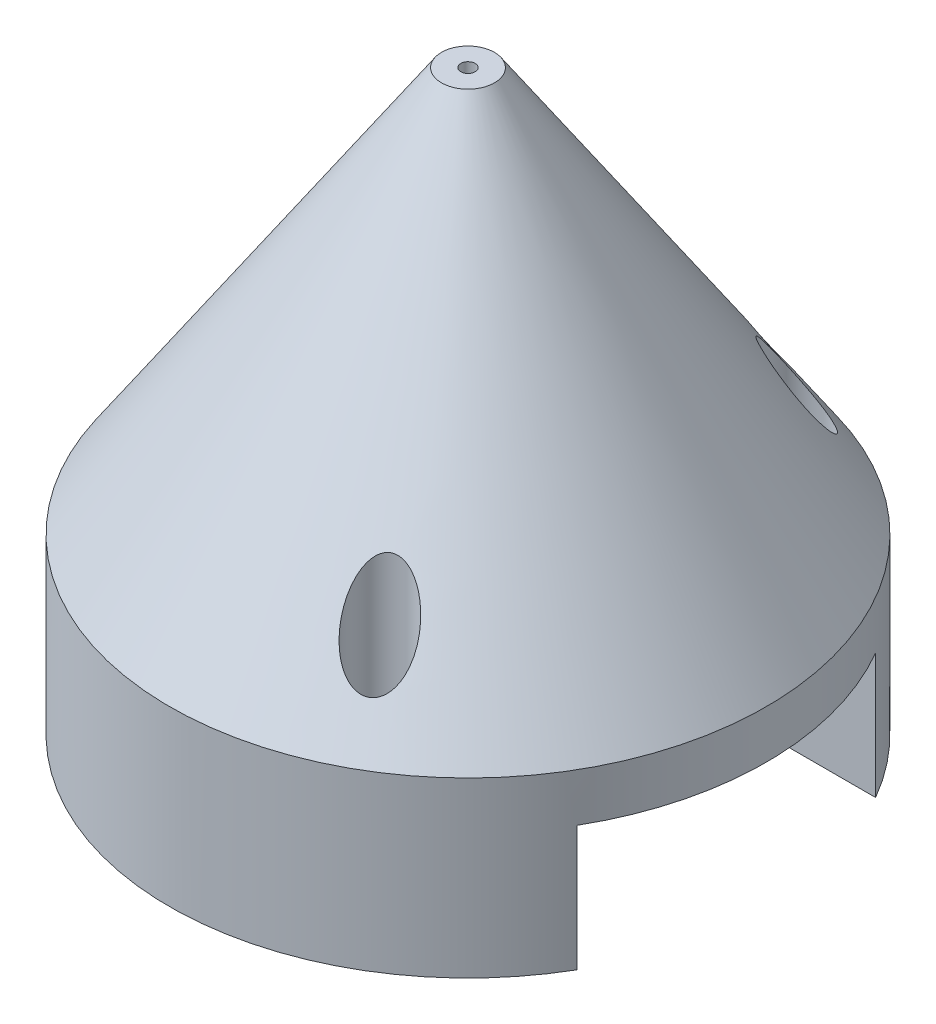
ISO-10303-21;
HEADER;
FILE_DESCRIPTION(('STEP AP214'),'2;1');
FILE_NAME('part.step','',(''),(''),'','','');
FILE_SCHEMA(('AUTOMOTIVE_DESIGN { 1 0 10303 214 1 1 1 1 }'));
ENDSEC;
DATA;
#1=APPLICATION_CONTEXT('core data for automotive mechanical design processes');
#2=APPLICATION_PROTOCOL_DEFINITION('international standard','automotive_design',2000,#1);
#3=PRODUCT_CONTEXT('',#1,'mechanical');
#4=PRODUCT('Part','Part','',(#3));
#5=PRODUCT_RELATED_PRODUCT_CATEGORY('part','',(#4));
#6=PRODUCT_DEFINITION_FORMATION('','',#4);
#7=PRODUCT_DEFINITION_CONTEXT('part definition',#1,'design');
#8=PRODUCT_DEFINITION('design','',#6,#7);
#9=PRODUCT_DEFINITION_SHAPE('','',#8);
#10=(LENGTH_UNIT() NAMED_UNIT(*) SI_UNIT(.MILLI.,.METRE.));
#11=(NAMED_UNIT(*) PLANE_ANGLE_UNIT() SI_UNIT($,.RADIAN.));
#12=(NAMED_UNIT(*) SI_UNIT($,.STERADIAN.) SOLID_ANGLE_UNIT());
#13=UNCERTAINTY_MEASURE_WITH_UNIT(LENGTH_MEASURE(1.E-05),#10,'distance_accuracy_value','');
#14=(GEOMETRIC_REPRESENTATION_CONTEXT(3) GLOBAL_UNCERTAINTY_ASSIGNED_CONTEXT((#13)) GLOBAL_UNIT_ASSIGNED_CONTEXT((#10,
#11,#12)) REPRESENTATION_CONTEXT('',''));
#15=CARTESIAN_POINT('',(0.,0.,0.));
#16=DIRECTION('',(0.,0.,1.));
#17=DIRECTION('',(1.,0.,0.));
#18=AXIS2_PLACEMENT_3D('',#15,#16,#17);
#19=CARTESIAN_POINT('',(-2.7248039285549,60.,0.));
#20=DIRECTION('',(0.,-1.,0.));
#21=DIRECTION('',(1.,0.,0.));
#22=AXIS2_PLACEMENT_3D('',#19,#20,#21);
#23=CONICAL_SURFACE('',#22,2.75,0.592112169453662);
#24=CARTESIAN_POINT('',(9.81892468476819,22.9681463679433,24.6503163790771));
#25=CARTESIAN_POINT('',(9.71175431657363,23.0383370458882,24.6518792558647));
#26=CARTESIAN_POINT('',(9.60769990579407,23.113342135412,24.647661909815));
#27=CARTESIAN_POINT('',(9.4061092604202,23.2707096242355,24.6295666741721));
#28=CARTESIAN_POINT('',(9.30858148344576,23.3530812587125,24.6156765058352));
#29=CARTESIAN_POINT('',(9.11967704423,23.5237976260614,24.5797277474133));
#30=CARTESIAN_POINT('',(9.02833335147779,23.6121700029236,24.5576289152983));
#31=CARTESIAN_POINT('',(8.85215336730015,23.7931966957878,24.5065759324488));
#32=CARTESIAN_POINT('',(8.76731517630449,23.8858497490956,24.4776237930109));
#33=CARTESIAN_POINT('',(8.57045398776997,24.1130237982506,24.400884911565));
#34=CARTESIAN_POINT('',(8.46146174607309,24.2492037958046,24.3502331010308));
#35=CARTESIAN_POINT('',(8.25492344513037,24.5263558072632,24.2395533825569));
#36=CARTESIAN_POINT('',(8.15738332784702,24.6673302602906,24.1795206446225));
#37=CARTESIAN_POINT('',(7.9731139000441,24.9526936468035,24.0516905962282));
#38=CARTESIAN_POINT('',(7.88638217527903,25.097081809173,23.9838950262495));
#39=CARTESIAN_POINT('',(7.72316223872366,25.3883204661096,23.8417225389886));
#40=CARTESIAN_POINT('',(7.64667316394029,25.5351707520562,23.7673461770482));
#41=CARTESIAN_POINT('',(7.47159372016466,25.8964570102,23.5784856884039));
#42=CARTESIAN_POINT('',(7.37833252984988,26.1118645479697,23.4608919231908));
#43=CARTESIAN_POINT('',(7.21149314141496,26.5446885398245,23.2156975515183));
#44=CARTESIAN_POINT('',(7.13792539650536,26.7621059976796,23.0880916769492));
#45=CARTESIAN_POINT('',(7.01033976187804,27.1975168051742,22.8241216463618));
#46=CARTESIAN_POINT('',(6.95633220507141,27.415510398097,22.6877529059048));
#47=CARTESIAN_POINT('',(6.86844118665959,27.8504115828426,22.4071978322987));
#48=CARTESIAN_POINT('',(6.83454714463722,28.067319686019,22.2630156529346));
#49=CARTESIAN_POINT('',(6.79634588515203,28.4226248819878,22.0192297377959));
#50=CARTESIAN_POINT('',(6.78582804497034,28.5618378341702,21.9217563387085));
#51=CARTESIAN_POINT('',(6.77444793715917,28.8384673708788,21.7237643114574));
#52=CARTESIAN_POINT('',(6.77358365265287,28.9758843246427,21.6232463237875));
#53=CARTESIAN_POINT('',(6.78238528068164,29.2478494670785,21.4193920473677));
#54=CARTESIAN_POINT('',(6.79202873835247,29.3824031491635,21.3160622267277));
#55=CARTESIAN_POINT('',(6.82306177293796,29.6477256804183,21.1064619509774));
#56=CARTESIAN_POINT('',(6.84444534672708,29.778496427988,21.000193025083));
#57=CARTESIAN_POINT('',(6.90402607625135,30.0497315433759,20.7720602252421));
#58=CARTESIAN_POINT('',(6.94389524533639,30.1895442845209,20.6498245347974));
#59=CARTESIAN_POINT('',(7.01901515937321,30.3913295125002,20.4640835311892));
#60=CARTESIAN_POINT('',(7.04660960054174,30.4572720640598,20.401768751846));
#61=CARTESIAN_POINT('',(7.10751529002262,30.5857767224469,20.2764688905868));
#62=CARTESIAN_POINT('',(7.14082485606949,30.6483398169234,20.21348401102));
#63=CARTESIAN_POINT('',(7.22992717791572,30.7957902233958,20.0591931572683));
#64=CARTESIAN_POINT('',(7.28916368522575,30.8783874009305,19.9676202503764));
#65=CARTESIAN_POINT('',(7.42319720641371,31.0304897024569,19.7849242776056));
#66=CARTESIAN_POINT('',(7.49796344258256,31.1000202112474,19.6938006815292));
#67=CARTESIAN_POINT('',(7.64141522471294,31.2031465607041,19.5400188989636));
#68=CARTESIAN_POINT('',(7.70589223608405,31.2413486475021,19.4765657514862));
#69=CARTESIAN_POINT('',(7.84384204246307,31.3051701206168,19.3531569750827));
#70=CARTESIAN_POINT('',(7.91730474561358,31.3308034637153,19.2931975321403));
#71=CARTESIAN_POINT('',(8.07279117597584,31.3671665926049,19.1785497894393));
#72=CARTESIAN_POINT('',(8.15488274098596,31.3777670552816,19.1239109509235));
#73=CARTESIAN_POINT('',(8.32443551106708,31.3823390343652,19.022894652775));
#74=CARTESIAN_POINT('',(8.41189525008586,31.3763150713318,18.9765149509462));
#75=CARTESIAN_POINT('',(8.57824747297976,31.3500876579438,18.8984075638014));
#76=CARTESIAN_POINT('',(8.65692512758836,31.3316515251106,18.8655943145927));
#77=CARTESIAN_POINT('',(8.81381245635934,31.2840560803526,18.8076178680729));
#78=CARTESIAN_POINT('',(8.89202188509359,31.2548915729932,18.782458388059));
#79=CARTESIAN_POINT('',(9.08500815538848,31.1710262604499,18.7286368860428));
#80=CARTESIAN_POINT('',(9.1986338294643,31.1108383768505,18.7044522382036));
#81=CARTESIAN_POINT('',(9.41955123897961,30.9764852866306,18.6696778015186));
#82=CARTESIAN_POINT('',(9.52682464699593,30.9022819999043,18.6591256796579));
#83=CARTESIAN_POINT('',(9.7167775489822,30.7576868469777,18.6499664416458));
#84=CARTESIAN_POINT('',(9.80054065489763,30.6887863724122,18.6496356395047));
#85=CARTESIAN_POINT('',(9.9634956089938,30.5459738451371,18.6554394061393));
#86=CARTESIAN_POINT('',(10.0426842928696,30.4720583984483,18.6615783951418));
#87=CARTESIAN_POINT('',(10.1968034462851,30.3203673306701,18.679394211858));
#88=CARTESIAN_POINT('',(10.2717274842081,30.2425861940997,18.6910791680628));
#89=CARTESIAN_POINT('',(10.4174994816405,30.0841116934288,18.719261107801));
#90=CARTESIAN_POINT('',(10.488345957693,30.0034172866097,18.735759829545));
#91=CARTESIAN_POINT('',(10.6820128497927,29.7735716322239,18.7880474972362));
#92=CARTESIAN_POINT('',(10.8005099292611,29.6218543155026,18.828643829555));
#93=CARTESIAN_POINT('',(11.0263309222846,29.3136263148129,18.9212498409892));
#94=CARTESIAN_POINT('',(11.133646213148,29.1571120503484,18.9732682334277));
#95=CARTESIAN_POINT('',(11.3381540789879,28.8406188312475,19.0872601699283));
#96=CARTESIAN_POINT('',(11.4353237646238,28.6806329856472,19.1492554553059));
#97=CARTESIAN_POINT('',(11.6197958462313,28.358715848473,19.2820162350544));
#98=CARTESIAN_POINT('',(11.7071001783492,28.196784945556,19.3527800028124));
#99=CARTESIAN_POINT('',(11.9007299643649,27.8155219662376,19.5282309653154));
#100=CARTESIAN_POINT('',(12.0031847145082,27.5957151820307,19.6361840064544));
#101=CARTESIAN_POINT('',(12.1908172415893,27.1555950108947,19.8654956916684));
#102=CARTESIAN_POINT('',(12.2759864706413,26.9352814275435,19.9868609226282));
#103=CARTESIAN_POINT('',(12.4280912726729,26.4960940936322,20.2420283024133));
#104=CARTESIAN_POINT('',(12.4950575288676,26.2772185346781,20.3758090063247));
#105=CARTESIAN_POINT('',(12.6093662389569,25.8422092421615,20.6554980322571));
#106=CARTESIAN_POINT('',(12.6567219724013,25.6260737495797,20.8013980668563));
#107=CARTESIAN_POINT('',(12.713963495255,25.2888170958293,21.0409146184167));
#108=CARTESIAN_POINT('',(12.7312275593523,25.1661160370759,21.1305913426609));
#109=CARTESIAN_POINT('',(12.7576695387633,24.9227904930492,21.3138481194231));
#110=CARTESIAN_POINT('',(12.7668494130894,24.8021655116382,21.4074272205324));
#111=CARTESIAN_POINT('',(12.7762617839242,24.5637074037459,21.5983461996986));
#112=CARTESIAN_POINT('',(12.7765018327099,24.44587200477,21.6956828338282));
#113=CARTESIAN_POINT('',(12.7669537809626,24.2137849940005,21.8940145396849));
#114=CARTESIAN_POINT('',(12.7571688840741,24.0995322493293,21.9950084327255));
#115=CARTESIAN_POINT('',(12.7201210003866,23.8315936528534,22.2409203413609));
#116=CARTESIAN_POINT('',(12.6874952485234,23.6800833274089,22.3874834604993));
#117=CARTESIAN_POINT('',(12.5952546177022,23.39088132022,22.6858124193257));
#118=CARTESIAN_POINT('',(12.5356860611421,23.2531664145297,22.8375689178858));
#119=CARTESIAN_POINT('',(12.4083971233779,23.0410397234363,23.09262826397));
#120=CARTESIAN_POINT('',(12.3497712561824,22.9606873642528,23.1954842494528));
#121=CARTESIAN_POINT('',(12.2155444120707,22.8133842699786,23.3998020548958));
#122=CARTESIAN_POINT('',(12.1399686854584,22.7464138774648,23.5012657128443));
#123=CARTESIAN_POINT('',(11.9880272003176,22.6424179073172,23.6789559570859));
#124=CARTESIAN_POINT('',(11.9150180341887,22.6020666451275,23.7560825510542));
#125=CARTESIAN_POINT('',(11.7577524422141,22.5353374232943,23.9047744224037));
#126=CARTESIAN_POINT('',(11.6735054807876,22.5089477971031,23.9763443002472));
#127=CARTESIAN_POINT('',(11.4946597775895,22.4721984270001,24.1115445272975));
#128=CARTESIAN_POINT('',(11.3999965667333,22.4619453057621,24.1751195338047));
#129=CARTESIAN_POINT('',(11.2037943085062,22.458831766571,24.2911052713799));
#130=CARTESIAN_POINT('',(11.1022564574067,22.4659683301242,24.3435179382847));
#131=CARTESIAN_POINT('',(10.9065927498695,22.4953149270133,24.4309700211916));
#132=CARTESIAN_POINT('',(10.8127600323137,22.5159222467634,24.4672325413613));
#133=CARTESIAN_POINT('',(10.6251012492638,22.5690815402157,24.5294270336775));
#134=CARTESIAN_POINT('',(10.5312751939954,22.6016370545078,24.5553559389244));
#135=CARTESIAN_POINT('',(10.3314822092628,22.6825237844355,24.6006480496581));
#136=CARTESIAN_POINT('',(10.2258294905642,22.7324978089078,24.6184213946972));
#137=CARTESIAN_POINT('',(10.0188769094323,22.8429978877632,24.6425407122131));
#138=CARTESIAN_POINT('',(9.91758054209569,22.9035322248204,24.6488776702999));
#139=CARTESIAN_POINT('',(9.81892468476819,22.9681463679433,24.6503163790771));
#140=B_SPLINE_CURVE_WITH_KNOTS('',3,(#24,#25,#26,#27,#28,#29,#30,#31,#32,#33,#34,#35,#36,#37,
#38,#39,#40,#41,#42,#43,#44,#45,#46,#47,#48,#49,#50,#51,#52,#53,#54,#55,#56,#57,#58,#59,#60,#61,
#62,#63,#64,#65,#66,#67,#68,#69,#70,#71,#72,#73,#74,#75,#76,#77,#78,#79,#80,#81,#82,#83,#84,#85,
#86,#87,#88,#89,#90,#91,#92,#93,#94,#95,#96,#97,#98,#99,#100,#101,#102,#103,#104,#105,#106,#107,
#108,#109,#110,#111,#112,#113,#114,#115,#116,#117,#118,#119,#120,#121,#122,#123,#124,#125,#126,
#127,#128,#129,#130,#131,#132,#133,#134,#135,#136,#137,#138,#139),.UNSPECIFIED.,.T.,.F.,(4,2,2,
2,2,2,2,2,2,2,2,2,2,2,2,2,2,2,2,2,2,2,2,2,2,2,2,2,2,2,2,2,2,2,2,2,2,2,2,2,2,2,2,2,2,2,2,2,2,2,2,
2,2,2,2,2,2,4),(0.,0.384126322893622,0.768741149213652,1.15526694000265,1.541679434212,
2.0857450302144,2.6300916800202,3.17431652160853,3.7184954807179,4.50504115318169,
5.29200349714424,6.0793809594046,6.86634386538806,7.37688864104268,7.88732674872684,
8.39667619442848,8.90576543446484,9.47431228415176,9.75861436190314,10.0428328975396,
10.4521125823219,10.8605887428986,11.1541287376024,11.447342032632,11.7430627569243,
12.0387030759492,12.2992634538066,12.5599501798243,12.9502408628465,13.3416076378417,
13.6665360969028,13.9916866943846,14.317315330044,14.6430616933288,15.2323502853013,
15.8220899878135,16.4131326811488,17.0040591759214,17.7994503273771,18.595233855503,
19.3896675610842,20.1835624211884,20.6421987782369,21.1007239649932,21.5588617853752,
22.0168532455585,22.6550761561125,23.2922059253588,23.7201940593106,24.1475488025858,
24.4870464771266,24.8262600125683,25.1677056450014,25.5090920136772,25.8158434989183,
26.1226859568393,26.4760156900556,26.829623803432),.UNSPECIFIED.);
#141=CARTESIAN_POINT('',(9.81892468476819,22.9681463679433,24.6503163790771));
#142=VERTEX_POINT('',#141);
#143=EDGE_CURVE('E113',#142,#142,#140,.T.);
#144=ORIENTED_EDGE('',*,*,#143,.T.);
#145=EDGE_LOOP('',(#144));
#146=FACE_BOUND('',#145,.T.);
#147=CARTESIAN_POINT('',(-2.7248039285549,60.,0.));
#148=DIRECTION('',(0.,1.,0.));
#149=DIRECTION('',(-1.,0.,0.));
#150=AXIS2_PLACEMENT_3D('',#147,#148,#149);
#151=CIRCLE('',#150,2.75);
#152=CARTESIAN_POINT('',(-5.4748039285549,60.,0.));
#153=VERTEX_POINT('',#152);
#154=EDGE_CURVE('E80',#153,#153,#151,.T.);
#155=ORIENTED_EDGE('',*,*,#154,.F.);
#156=EDGE_LOOP('',(#155));
#157=FACE_BOUND('',#156,.T.);
#158=CARTESIAN_POINT('',(-2.7248039285549,18.,0.));
#159=DIRECTION('',(0.,1.,0.));
#160=DIRECTION('',(-1.,0.,0.));
#161=AXIS2_PLACEMENT_3D('',#158,#159,#160);
#162=CIRCLE('',#161,31.);
#163=CARTESIAN_POINT('',(-33.7248039285549,18.,0.));
#164=VERTEX_POINT('',#163);
#165=EDGE_CURVE('E153',#164,#164,#162,.T.);
#166=ORIENTED_EDGE('',*,*,#165,.T.);
#167=EDGE_LOOP('',(#166));
#168=FACE_BOUND('',#167,.T.);
#169=CARTESIAN_POINT('',(-30.5054118122256,22.7524313597325,-1.12615265273772));
#170=CARTESIAN_POINT('',(-30.4409707701596,22.8385786249351,-1.28525887783984));
#171=CARTESIAN_POINT('',(-30.3655733265612,22.939647901942,-1.43212663372406));
#172=CARTESIAN_POINT('',(-30.2421924948899,23.1057799359499,-1.63372326899994));
#173=CARTESIAN_POINT('',(-30.19918950725,23.1637982186939,-1.69798864411151));
#174=CARTESIAN_POINT('',(-30.1104033589527,23.2838588201346,-1.82061132164044));
#175=CARTESIAN_POINT('',(-30.0646207161147,23.3459003894828,-1.87896971909325));
#176=CARTESIAN_POINT('',(-29.9501356119617,23.5014187091377,-2.014674656505));
#177=CARTESIAN_POINT('',(-29.8802559197009,23.5966570517023,-2.08899602596415));
#178=CARTESIAN_POINT('',(-29.7372745420672,23.7922544126897,-2.22706944609588));
#179=CARTESIAN_POINT('',(-29.6641711295398,23.8926161807136,-2.29081574175347));
#180=CARTESIAN_POINT('',(-29.5157307398823,24.097203655073,-2.40864237406987));
#181=CARTESIAN_POINT('',(-29.4403942811965,24.2014284659149,-2.46272493417135));
#182=CARTESIAN_POINT('',(-29.2881482993478,24.4129075086674,-2.56207228337111));
#183=CARTESIAN_POINT('',(-29.2112382440025,24.5201627702937,-2.60733403297088));
#184=CARTESIAN_POINT('',(-29.0096129231187,24.8025157927312,-2.71460492981343));
#185=CARTESIAN_POINT('',(-28.8840751020111,24.9794705095757,-2.77022253208341));
#186=CARTESIAN_POINT('',(-28.6318695363632,25.3374594765901,-2.86273870517096));
#187=CARTESIAN_POINT('',(-28.5052011617664,25.5184961001006,-2.89962607640048));
#188=CARTESIAN_POINT('',(-28.2515435464025,25.8836350682021,-2.95625928184561));
#189=CARTESIAN_POINT('',(-28.1245542670797,26.0677437423394,-2.97596364883916));
#190=CARTESIAN_POINT('',(-27.8714089244505,26.4374591435085,-2.99910922520618));
#191=CARTESIAN_POINT('',(-27.7452526856132,26.6230655353681,-3.00255397743775));
#192=CARTESIAN_POINT('',(-27.4884124033988,27.0037759676538,-2.99356183666021));
#193=CARTESIAN_POINT('',(-27.3577999121949,27.1989102054641,-2.98035850220354));
#194=CARTESIAN_POINT('',(-27.0988474484454,27.5888693942604,-2.93690686749563));
#195=CARTESIAN_POINT('',(-26.9705081170059,27.7836942443172,-2.90665383520112));
#196=CARTESIAN_POINT('',(-26.7173118922842,28.1711509045477,-2.82885867661913));
#197=CARTESIAN_POINT('',(-26.5924440954425,28.3637880939992,-2.78137938897174));
#198=CARTESIAN_POINT('',(-26.3466433180439,28.7460374773344,-2.66814234310258));
#199=CARTESIAN_POINT('',(-26.225707864246,28.9356515328037,-2.60239633220702));
#200=CARTESIAN_POINT('',(-25.9947142012167,29.3007098528076,-2.45452030187566));
#201=CARTESIAN_POINT('',(-25.8844142523616,29.4763894321818,-2.37336969764094));
#202=CARTESIAN_POINT('',(-25.7234110750824,29.734716221016,-2.23593480672722));
#203=CARTESIAN_POINT('',(-25.6704046997687,29.8200897637647,-2.18741635457007));
#204=CARTESIAN_POINT('',(-25.5662313005299,29.9884866698441,-2.08468712396905));
#205=CARTESIAN_POINT('',(-25.515063738905,30.0715107186715,-2.0304780280471));
#206=CARTESIAN_POINT('',(-25.4142325016401,30.2356993057478,-1.91499837751489));
#207=CARTESIAN_POINT('',(-25.3646002788635,30.3168210113258,-1.85363889208912));
#208=CARTESIAN_POINT('',(-25.2681392040452,30.4750258493488,-1.72375947442535));
#209=CARTESIAN_POINT('',(-25.2213117226947,30.5521070048971,-1.6552360853441));
#210=CARTESIAN_POINT('',(-25.131499157932,30.7004225265904,-1.51062252606935));
#211=CARTESIAN_POINT('',(-25.088495781462,30.7716845783533,-1.43457251959916));
#212=CARTESIAN_POINT('',(-25.0072241251893,30.9067548799366,-1.27391116013828));
#213=CARTESIAN_POINT('',(-24.9689487848068,30.9705742360874,-1.1893129246681));
#214=CARTESIAN_POINT('',(-24.9020133812292,31.0824574991427,-1.01948746170751));
#215=CARTESIAN_POINT('',(-24.872782194133,31.1314470099508,-0.935106298214802));
#216=CARTESIAN_POINT('',(-24.8209319253788,31.2184987916331,-0.758908842910004));
#217=CARTESIAN_POINT('',(-24.7983093759664,31.256566793169,-0.667096482891662));
#218=CARTESIAN_POINT('',(-24.7612045041018,31.3190759945615,-0.476054234690661));
#219=CARTESIAN_POINT('',(-24.7468158785065,31.3433603205312,-0.3767529803692));
#220=CARTESIAN_POINT('',(-24.7281749350493,31.3748321595737,-0.174564814472995));
#221=CARTESIAN_POINT('',(-24.7239094176874,31.382041936091,-0.071682749817347));
#222=CARTESIAN_POINT('',(-24.7258920358999,31.3786929059792,0.121343426715041));
#223=CARTESIAN_POINT('',(-24.7309467147336,31.3701510870693,0.211543049071452));
#224=CARTESIAN_POINT('',(-24.7487855768649,31.3400365858427,0.388944880043752));
#225=CARTESIAN_POINT('',(-24.76157513266,31.3184548462563,0.476144960702134));
#226=CARTESIAN_POINT('',(-24.7981327841184,31.2568607164943,0.668236789334551));
#227=CARTESIAN_POINT('',(-24.8239188142377,31.2134685149866,0.771646783227253));
#228=CARTESIAN_POINT('',(-24.8837297520391,31.1130867653598,0.969015074393575));
#229=CARTESIAN_POINT('',(-24.9177711646751,31.0560699810536,1.06295389654647));
#230=CARTESIAN_POINT('',(-25.0129122487774,30.8972122020122,1.29171826098144));
#231=CARTESIAN_POINT('',(-25.0784381821267,30.7882377484215,1.41968703729292));
#232=CARTESIAN_POINT('',(-25.2190683033588,30.55568270568,1.65534981902866));
#233=CARTESIAN_POINT('',(-25.2941963522978,30.4320657883465,1.76299160268873));
#234=CARTESIAN_POINT('',(-25.4432072304251,30.1883395447917,1.95121034544437));
#235=CARTESIAN_POINT('',(-25.51648007981,30.069089808682,2.03341042098922));
#236=CARTESIAN_POINT('',(-25.6670424980114,29.825398542955,2.18565540223149));
#237=CARTESIAN_POINT('',(-25.744335141636,29.7009530538052,2.25569081986));
#238=CARTESIAN_POINT('',(-25.9021538403144,29.4482747265619,2.3850296876394));
#239=CARTESIAN_POINT('',(-25.9826852717369,29.3200356930813,2.44431431045339));
#240=CARTESIAN_POINT('',(-26.1462781545125,29.0609956248974,2.55301703370937));
#241=CARTESIAN_POINT('',(-26.229340370323,28.9301938204199,2.60243211817829));
#242=CARTESIAN_POINT('',(-26.4471147988759,28.5891933960988,2.71854553673487));
#243=CARTESIAN_POINT('',(-26.5834245634122,28.3776213139853,2.77827324894182));
#244=CARTESIAN_POINT('',(-26.8600648563853,27.9520826065623,2.87641408177333));
#245=CARTESIAN_POINT('',(-27.0003977999417,27.7381145920069,2.91481410516112));
#246=CARTESIAN_POINT('',(-27.2841137193346,27.3093457839299,2.97097815460498));
#247=CARTESIAN_POINT('',(-27.4274981812939,27.0945446283216,2.98873188013306));
#248=CARTESIAN_POINT('',(-27.7162713571876,26.6656833406288,3.00346829387583));
#249=CARTESIAN_POINT('',(-27.8616591608784,26.4516229239204,3.00046012388727));
#250=CARTESIAN_POINT('',(-28.1201678201229,26.0742130290595,2.97598253236831));
#251=CARTESIAN_POINT('',(-28.2330847498678,25.9104332400117,2.95888037180653));
#252=CARTESIAN_POINT('',(-28.4589870258216,25.5848513385754,2.91106710775026));
#253=CARTESIAN_POINT('',(-28.5719723791909,25.4230494952032,2.88035417378653));
#254=CARTESIAN_POINT('',(-28.796976637966,25.1028122324617,2.80437357656668));
#255=CARTESIAN_POINT('',(-28.9089972901736,24.9443691686912,2.75914387864072));
#256=CARTESIAN_POINT('',(-29.1312977650645,24.6318008244255,2.65272639343545));
#257=CARTESIAN_POINT('',(-29.2415786068008,24.4776729720474,2.59154834574095));
#258=CARTESIAN_POINT('',(-29.4713690580024,24.1583266172116,2.44341243735594));
#259=CARTESIAN_POINT('',(-29.5905253399115,23.9938047726665,2.35433186391325));
#260=CARTESIAN_POINT('',(-29.7640860449834,23.755544163379,2.20164555153595));
#261=CARTESIAN_POINT('',(-29.8210804734239,23.6775400553329,2.14756886001657));
#262=CARTESIAN_POINT('',(-29.9327932664084,23.5250693472746,2.03253822120153));
#263=CARTESIAN_POINT('',(-29.987512185037,23.4506018854573,1.97158596168031));
#264=CARTESIAN_POINT('',(-30.1212790698764,23.2690314277825,1.80913725839643));
#265=CARTESIAN_POINT('',(-30.1984486578358,23.1647273234502,1.70285398865105));
#266=CARTESIAN_POINT('',(-30.3425524689249,22.9706070100028,1.47168768123434));
#267=CARTESIAN_POINT('',(-30.4095059450642,22.8807635308011,1.34684052814501));
#268=CARTESIAN_POINT('',(-30.5115415987456,22.7441979162082,1.11589553092989));
#269=CARTESIAN_POINT('',(-30.5502895105377,22.6924571525773,1.01441727851032));
#270=CARTESIAN_POINT('',(-30.6176470340285,22.6026401738202,0.802370290852159));
#271=CARTESIAN_POINT('',(-30.6462646594814,22.564553157335,0.691808826756777));
#272=CARTESIAN_POINT('',(-30.6912325181051,22.5047535519858,0.462643453207352));
#273=CARTESIAN_POINT('',(-30.70746238478,22.4832016171839,0.34397254311446));
#274=CARTESIAN_POINT('',(-30.7254264961199,22.4593486554741,0.103630252090297));
#275=CARTESIAN_POINT('',(-30.7271717352918,22.4570330273125,-0.0180387827504194));
#276=CARTESIAN_POINT('',(-30.7167983758188,22.4708049741648,-0.242519811561146));
#277=CARTESIAN_POINT('',(-30.706581465299,22.4843681806714,-0.345592794923484));
#278=CARTESIAN_POINT('',(-30.676180566341,22.5247665339622,-0.547537398944022));
#279=CARTESIAN_POINT('',(-30.6559974626772,22.5516005026007,-0.64640939170984));
#280=CARTESIAN_POINT('',(-30.6143716326017,22.6070213695424,-0.809470177250507));
#281=CARTESIAN_POINT('',(-30.5950847250557,22.632718807945,-0.875235976213939));
#282=CARTESIAN_POINT('',(-30.5528627113728,22.6890369922856,-1.00330761974973));
#283=CARTESIAN_POINT('',(-30.5299303118868,22.7196540857319,-1.0656159854029));
#284=CARTESIAN_POINT('',(-30.5054118122256,22.7524313597325,-1.12615265273772));
#285=B_SPLINE_CURVE_WITH_KNOTS('',3,(#169,#170,#171,#172,#173,#174,#175,#176,#177,#178,#179,
#180,#181,#182,#183,#184,#185,#186,#187,#188,#189,#190,#191,#192,#193,#194,#195,#196,#197,#198,
#199,#200,#201,#202,#203,#204,#205,#206,#207,#208,#209,#210,#211,#212,#213,#214,#215,#216,#217,
#218,#219,#220,#221,#222,#223,#224,#225,#226,#227,#228,#229,#230,#231,#232,#233,#234,#235,#236,
#237,#238,#239,#240,#241,#242,#243,#244,#245,#246,#247,#248,#249,#250,#251,#252,#253,#254,#255,
#256,#257,#258,#259,#260,#261,#262,#263,#264,#265,#266,#267,#268,#269,#270,#271,#272,#273,#274,
#275,#276,#277,#278,#279,#280,#281,#282,#283,#284),.UNSPECIFIED.,.T.,.F.,(4,2,2,2,2,2,2,2,2,2,2,
2,2,2,2,2,2,2,2,2,2,2,2,2,2,2,2,2,2,2,2,2,2,2,2,2,2,2,2,2,2,2,2,2,2,2,2,2,2,2,2,2,2,2,2,2,2,4),
(0.,0.575795784903157,0.86564726848714,1.1554449206158,1.5734823337387,1.99174650414391,
2.40991431561463,2.82822596667683,3.4991400840532,4.17045489800402,4.84338532755259,
5.51616912342388,6.22108824958466,6.92620311831798,7.62877128391345,8.33088866972116,
8.99802717454469,9.33264968622316,9.66717353904763,10.0064227392962,10.3458364018243,
10.683527644915,11.0207083409719,11.32539952794,11.6299305457502,11.9378613409395,
12.2453904046653,12.5162349145545,12.7872677642651,13.1305632222544,13.4745507713887,
14.0127338113524,14.5522812189839,15.038535247,15.5251668519341,16.0126426097719,
16.5002671052509,17.27518968646,18.050587619426,18.8263722360646,19.6018152840496,
20.200390110943,20.7990454626853,21.3961477519036,21.9928862442369,22.6565975346074,
22.9884915692032,23.3203043089501,23.8219068892846,24.3225521663286,24.682223523734,
25.0416097171206,25.4044449560694,25.7670047609622,26.0789428726312,26.3908532961733,
26.6100938506878,26.8291723805259),.UNSPECIFIED.);
#286=CARTESIAN_POINT('',(-30.5054118122256,22.7524313597325,-1.12615265273772));
#287=VERTEX_POINT('',#286);
#288=EDGE_CURVE('E104',#287,#287,#285,.T.);
#289=ORIENTED_EDGE('',*,*,#288,.T.);
#290=EDGE_LOOP('',(#289));
#291=FACE_BOUND('',#290,.T.);
#292=CARTESIAN_POINT('',(9.81892468476782,22.9681463679434,-24.6503163790773));
#293=CARTESIAN_POINT('',(9.9216937806006,22.9008389385149,-24.6488171339514));
#294=CARTESIAN_POINT('',(10.0273347210191,22.8379543785461,-24.6420025891629));
#295=CARTESIAN_POINT('',(10.2433456348668,22.7237391651368,-24.6158761063843));
#296=CARTESIAN_POINT('',(10.3537146530548,22.6724061908445,-24.5965666817919));
#297=CARTESIAN_POINT('',(10.5782691437449,22.5840463985687,-24.5434709665511));
#298=CARTESIAN_POINT('',(10.6924825407244,22.5471756590808,-24.5095346107326));
#299=CARTESIAN_POINT('',(10.9197898879744,22.4918801381132,-24.4263296083496));
#300=CARTESIAN_POINT('',(11.0328851783116,22.4734296802229,-24.3770824298709));
#301=CARTESIAN_POINT('',(11.241272597224,22.4578352478987,-24.2703336243893));
#302=CARTESIAN_POINT('',(11.3371657130647,22.4585986021322,-24.214305299356));
#303=CARTESIAN_POINT('',(11.5211157849629,22.4762517967529,-24.0927483465927));
#304=CARTESIAN_POINT('',(11.6091715966218,22.4931439880543,-24.0272183350928));
#305=CARTESIAN_POINT('',(11.7694577628487,22.5398797682324,-23.8940790325259));
#306=CARTESIAN_POINT('',(11.842360693662,22.5687498960833,-23.8269247569018));
#307=CARTESIAN_POINT('',(11.9787150218488,22.6373213953115,-23.688756640353));
#308=CARTESIAN_POINT('',(12.0421635788162,22.6770260116241,-23.6177416482523));
#309=CARTESIAN_POINT('',(12.1912335969862,22.7891089534092,-23.4347899724352));
#310=CARTESIAN_POINT('',(12.2704478226419,22.8675796840298,-23.3213703130093));
#311=CARTESIAN_POINT('',(12.4087491222953,23.0396252476713,-23.0936374650581));
#312=CARTESIAN_POINT('',(12.4677807582737,23.1332406590444,-22.9793226838336));
#313=CARTESIAN_POINT('',(12.5571405881316,23.30907281731,-22.7776145724962));
#314=CARTESIAN_POINT('',(12.5909318350072,23.3892038522707,-22.6898805244831));
#315=CARTESIAN_POINT('',(12.6491438270975,23.5544877053722,-22.5159897429523));
#316=CARTESIAN_POINT('',(12.6735593057371,23.6396433150367,-22.4298339217575));
#317=CARTESIAN_POINT('',(12.7140756209061,23.8139201575049,-22.2594552480599));
#318=CARTESIAN_POINT('',(12.7301674579852,23.90304556986,-22.1752345814164));
#319=CARTESIAN_POINT('',(12.7548959086556,24.0843811505797,-22.0090290757705));
#320=CARTESIAN_POINT('',(12.76353000577,24.1765923492922,-21.9270450004943));
#321=CARTESIAN_POINT('',(12.7774538964916,24.4229174438242,-21.714050676429));
#322=CARTESIAN_POINT('',(12.7771207949467,24.5790890121848,-21.5850353610181));
#323=CARTESIAN_POINT('',(12.7610653640162,24.8959989957974,-21.3337131723678));
#324=CARTESIAN_POINT('',(12.7453335645554,25.0567401622484,-21.211410476217));
#325=CARTESIAN_POINT('',(12.700276579406,25.381760654583,-20.9734347120489));
#326=CARTESIAN_POINT('',(12.6709190839601,25.5460475003428,-20.8577781401844));
#327=CARTESIAN_POINT('',(12.5999740457308,25.8767245238187,-20.6335560110151));
#328=CARTESIAN_POINT('',(12.5583882402466,26.0431143995417,-20.524989449095));
#329=CARTESIAN_POINT('',(12.4493881655246,26.4288031320163,-20.2826435690715));
#330=CARTESIAN_POINT('',(12.3779636164306,26.6485846900292,-20.1514220150743));
#331=CARTESIAN_POINT('',(12.2172016606971,27.088964453695,-19.9017311769373));
#332=CARTESIAN_POINT('',(12.1278552467729,27.3095630150218,-19.7832683513582));
#333=CARTESIAN_POINT('',(11.9320877267627,27.7494722335053,-19.5602308236098));
#334=CARTESIAN_POINT('',(11.8257062300055,27.9687846837513,-19.4556249085343));
#335=CARTESIAN_POINT('',(11.5956310879745,28.404813823019,-19.2613477944714));
#336=CARTESIAN_POINT('',(11.4719506815008,28.6215323607492,-19.1716652885061));
#337=CARTESIAN_POINT('',(11.2741649888088,28.9405477670673,-19.0508532319874));
#338=CARTESIAN_POINT('',(11.2070103928102,29.0447410341665,-19.0132159481153));
#339=CARTESIAN_POINT('',(11.0681020138961,29.2515613790878,-18.9424112038113));
#340=CARTESIAN_POINT('',(10.996349110458,29.3541887517831,-18.9092428923816));
#341=CARTESIAN_POINT('',(10.8479540195193,29.557417513751,-18.847843643334));
#342=CARTESIAN_POINT('',(10.7713106383825,29.6580184004681,-18.8196139174334));
#343=CARTESIAN_POINT('',(10.6128113116981,29.8564950276373,-18.7687380161969));
#344=CARTESIAN_POINT('',(10.5309563418487,29.9543712732861,-18.7460907995652));
#345=CARTESIAN_POINT('',(10.3799268930165,30.1256973314329,-18.7114289769994));
#346=CARTESIAN_POINT('',(10.3118383485732,30.1998520960518,-18.6981741367562));
#347=CARTESIAN_POINT('',(10.1719829390867,30.3452921116977,-18.6761482686358));
#348=CARTESIAN_POINT('',(10.1002171095616,30.4165781605651,-18.6673759860291));
#349=CARTESIAN_POINT('',(9.95289490351399,30.5553500012553,-18.6549919002855));
#350=CARTESIAN_POINT('',(9.87734587662755,30.6228426592926,-18.6513704646467));
#351=CARTESIAN_POINT('',(9.72219820601543,30.7530018230808,-18.6501010535555));
#352=CARTESIAN_POINT('',(9.64260243997785,30.8156716808271,-18.6524488899279));
#353=CARTESIAN_POINT('',(9.46827704142676,30.9427054781028,-18.6649303735244));
#354=CARTESIAN_POINT('',(9.37294883180904,31.0061707849629,-18.676065322603));
#355=CARTESIAN_POINT('',(9.1774063691179,31.1218525905055,-18.709131321789));
#356=CARTESIAN_POINT('',(9.07719831007017,31.1740829157768,-18.7310489913713));
#357=CARTESIAN_POINT('',(8.89103887280675,31.255579850556,-18.7825513216086));
#358=CARTESIAN_POINT('',(8.80561364932102,31.2872544000776,-18.8101585296208));
#359=CARTESIAN_POINT('',(8.63436519022654,31.3376466929008,-18.874515203964));
#360=CARTESIAN_POINT('',(8.54854246765214,31.3563780269144,-18.9112550255079));
#361=CARTESIAN_POINT('',(8.37863602689553,31.3790684662044,-18.9938359310526));
#362=CARTESIAN_POINT('',(8.29456589381514,31.3829379311294,-19.0397304920686));
#363=CARTESIAN_POINT('',(8.13174154182115,31.375192807676,-19.1390310593369));
#364=CARTESIAN_POINT('',(8.05298839748213,31.363575099091,-19.1924385772882));
#365=CARTESIAN_POINT('',(7.90983583434522,31.3278587829972,-19.2995258599239));
#366=CARTESIAN_POINT('',(7.84478258093024,31.3049707666453,-19.3527531200547));
#367=CARTESIAN_POINT('',(7.72174302521171,31.2492367992564,-19.4620031190393));
#368=CARTESIAN_POINT('',(7.66375935060705,31.2163871612988,-19.5180268864911));
#369=CARTESIAN_POINT('',(7.5219276358123,31.1202747227468,-19.6660081318541));
#370=CARTESIAN_POINT('',(7.4436823900699,31.0506415002934,-19.7591797950592));
#371=CARTESIAN_POINT('',(7.30360282304426,30.8971919543185,-19.9462366331512));
#372=CARTESIAN_POINT('',(7.24181979195952,30.8133326055536,-20.0401231218092));
#373=CARTESIAN_POINT('',(7.14053592187201,30.6493510316189,-20.2129230150523));
#374=CARTESIAN_POINT('',(7.09908451842034,30.5705457463892,-20.2919756725774));
#375=CARTESIAN_POINT('',(7.02499177572737,30.4078203768552,-20.4490022824515));
#376=CARTESIAN_POINT('',(6.9923568055194,30.3238966483242,-20.5269754165738));
#377=CARTESIAN_POINT('',(6.9347780508171,30.1521620791272,-20.6816941185706));
#378=CARTESIAN_POINT('',(6.90984587029339,30.0643455995322,-20.7584376708264));
#379=CARTESIAN_POINT('',(6.8668539700022,29.8858329586029,-20.910509880837));
#380=CARTESIAN_POINT('',(6.84879668704575,29.7951357885245,-20.9858380279239));
#381=CARTESIAN_POINT('',(6.80702699069646,29.5390508526791,-21.1939568930721));
#382=CARTESIAN_POINT('',(6.79010894561439,29.3712387424854,-21.3251512715225));
#383=CARTESIAN_POINT('',(6.77318609255809,29.0311620947571,-21.5828400974919));
#384=CARTESIAN_POINT('',(6.77319408184324,28.8588942868048,-21.7093309165387));
#385=CARTESIAN_POINT('',(6.78835689647178,28.5113324518988,-21.9577008400794));
#386=CARTESIAN_POINT('',(6.80353604332233,28.3360340098572,-22.0795722133316));
#387=CARTESIAN_POINT('',(6.84792029402851,27.983912367287,-22.3183092863477));
#388=CARTESIAN_POINT('',(6.87712166580994,27.8070895847586,-22.4351763090313));
#389=CARTESIAN_POINT('',(6.95130271361855,27.4407981769681,-22.6714056407855));
#390=CARTESIAN_POINT('',(6.99721557894005,27.2512827486804,-22.7904025553896));
#391=CARTESIAN_POINT('',(7.10390543118468,26.8724270104326,-23.0219319742599));
#392=CARTESIAN_POINT('',(7.16468557031602,26.6830867461681,-23.1344631013719));
#393=CARTESIAN_POINT('',(7.30096604864376,26.3060228755474,-23.3519937213345));
#394=CARTESIAN_POINT('',(7.37643126986729,26.1182965065129,-23.4570103806439));
#395=CARTESIAN_POINT('',(7.5425209869107,25.7451073619928,-23.6586751739031));
#396=CARTESIAN_POINT('',(7.63313950752614,25.5596437250812,-23.7553265837054));
#397=CARTESIAN_POINT('',(7.79516728782484,25.2576547413485,-23.9060717043553));
#398=CARTESIAN_POINT('',(7.86194072617037,25.1400779246457,-23.9630727157327));
#399=CARTESIAN_POINT('',(8.00233866898933,24.9068639865365,-24.0723893591327));
#400=CARTESIAN_POINT('',(8.07596176097119,24.7912264709992,-24.1247059527985));
#401=CARTESIAN_POINT('',(8.23055495639044,24.5622018247867,-24.2240658229871));
#402=CARTESIAN_POINT('',(8.31154037782097,24.4488200131902,-24.2710976277393));
#403=CARTESIAN_POINT('',(8.48110137332863,24.2253225453759,-24.3588508944807));
#404=CARTESIAN_POINT('',(8.56967579097021,24.1152063949565,-24.3995733152675));
#405=CARTESIAN_POINT('',(8.74535298583639,23.9103132875465,-24.4697535567796));
#406=CARTESIAN_POINT('',(8.83167702802176,23.8151205347794,-24.4999379828994));
#407=CARTESIAN_POINT('',(9.01112549504734,23.6291345293044,-24.5532134372644));
#408=CARTESIAN_POINT('',(9.10425243194855,23.5383429225774,-24.5763018286473));
#409=CARTESIAN_POINT('',(9.2970311751762,23.362995406829,-24.6139028821813));
#410=CARTESIAN_POINT('',(9.39664828482521,23.2784107721072,-24.6284575592815));
#411=CARTESIAN_POINT('',(9.60273328274234,23.116925413023,-24.6474580062714));
#412=CARTESIAN_POINT('',(9.70919186981229,23.0400146045837,-24.6519172142957));
#413=CARTESIAN_POINT('',(9.81892468476782,22.9681463679434,-24.6503163790773));
#414=B_SPLINE_CURVE_WITH_KNOTS('',3,(#292,#293,#294,#295,#296,#297,#298,#299,#300,#301,#302,
#303,#304,#305,#306,#307,#308,#309,#310,#311,#312,#313,#314,#315,#316,#317,#318,#319,#320,#321,
#322,#323,#324,#325,#326,#327,#328,#329,#330,#331,#332,#333,#334,#335,#336,#337,#338,#339,#340,
#341,#342,#343,#344,#345,#346,#347,#348,#349,#350,#351,#352,#353,#354,#355,#356,#357,#358,#359,
#360,#361,#362,#363,#364,#365,#366,#367,#368,#369,#370,#371,#372,#373,#374,#375,#376,#377,#378,
#379,#380,#381,#382,#383,#384,#385,#386,#387,#388,#389,#390,#391,#392,#393,#394,#395,#396,#397,
#398,#399,#400,#401,#402,#403,#404,#405,#406,#407,#408,#409,#410,#411,#412,#413),.UNSPECIFIED.,
.T.,.F.,(4,2,2,2,2,2,2,2,2,2,2,2,2,2,2,2,2,2,2,2,2,2,2,2,2,2,2,2,2,2,2,2,2,2,2,2,2,2,2,2,2,2,2,
2,2,2,2,2,2,2,2,2,2,2,2,2,2,2,2,2,4),(0.,0.368328604457199,0.73658314109074,1.10870924277513,
1.480315902926,1.81164358458521,2.14301956742247,2.45154381598701,2.76016056934615,
3.2346218614511,3.71037613710407,4.08047396394946,4.45077937983296,4.82148433427695,
5.19231432745845,5.79908174996999,6.40622256416449,7.01481046681267,7.62331194795787,
8.41958529514912,9.21625984571419,10.011108200677,10.8053515556196,11.1938603843261,
11.5822951268975,11.9708250414519,12.359282429266,12.663732149967,12.9680966042647,
13.271891120572,13.5754725466622,13.919740711387,14.2635827393577,14.5480508667809,
14.8322198395282,15.1181001291374,15.4040380238622,15.6643748555917,15.9248081590815,
16.3429637614175,16.7624073395818,17.119117325071,17.4760843146279,17.8335864688485,
18.191215222183,18.8312513900552,19.4717714699641,20.1133200436676,20.7546979610788,
21.4394340659884,22.1243154769277,22.8075787523238,23.4905732379385,23.930577173652,
24.3704905748455,24.8113411716771,25.2521247093554,25.6477545385874,26.0435312052615,
26.4373425747448,26.8306294307612),.UNSPECIFIED.);
#415=CARTESIAN_POINT('',(9.81892468476782,22.9681463679434,-24.6503163790773));
#416=VERTEX_POINT('',#415);
#417=EDGE_CURVE('E158',#416,#416,#414,.T.);
#418=ORIENTED_EDGE('',*,*,#417,.T.);
#419=EDGE_LOOP('',(#418));
#420=FACE_BOUND('',#419,.T.);
#421=ADVANCED_FACE('F32',(#146,#157,#168,#291,#420),#23,.T.);
#422=CARTESIAN_POINT('',(-5.4748039285549,60.,0.));
#423=DIRECTION('',(0.,1.,0.));
#424=DIRECTION('',(-1.,0.,0.));
#425=AXIS2_PLACEMENT_3D('',#422,#423,#424);
#426=PLANE('',#425);
#427=ORIENTED_EDGE('',*,*,#154,.T.);
#428=EDGE_LOOP('',(#427));
#429=FACE_BOUND('',#428,.T.);
#430=CARTESIAN_POINT('',(-2.7248039285549,60.,0.));
#431=DIRECTION('',(0.,1.,0.));
#432=DIRECTION('',(-1.,0.,0.));
#433=AXIS2_PLACEMENT_3D('',#430,#431,#432);
#434=CIRCLE('',#433,0.75);
#435=CARTESIAN_POINT('',(-3.4748039285549,60.,0.));
#436=VERTEX_POINT('',#435);
#437=EDGE_CURVE('E90',#436,#436,#434,.T.);
#438=ORIENTED_EDGE('',*,*,#437,.F.);
#439=EDGE_LOOP('',(#438));
#440=FACE_BOUND('',#439,.T.);
#441=ADVANCED_FACE('F137',(#429,#440),#426,.T.);
#442=CARTESIAN_POINT('',(-2.7248039285549,66.8317059543051,0.));
#443=DIRECTION('',(0.,1.,0.));
#444=DIRECTION('',(-1.,0.,0.));
#445=AXIS2_PLACEMENT_3D('',#442,#443,#444);
#446=CYLINDRICAL_SURFACE('',#445,0.749999999999999);
#447=CARTESIAN_POINT('',(-2.7248039285549,15.5,0.));
#448=DIRECTION('',(0.,-1.,0.));
#449=DIRECTION('',(1.,0.,0.));
#450=AXIS2_PLACEMENT_3D('',#447,#448,#449);
#451=CIRCLE('',#450,0.749999999999999);
#452=CARTESIAN_POINT('',(-1.9748039285549,15.5,0.));
#453=VERTEX_POINT('',#452);
#454=EDGE_CURVE('E11',#453,#453,#451,.T.);
#455=ORIENTED_EDGE('',*,*,#454,.T.);
#456=EDGE_LOOP('',(#455));
#457=FACE_BOUND('',#456,.T.);
#458=ORIENTED_EDGE('',*,*,#437,.T.);
#459=EDGE_LOOP('',(#458));
#460=FACE_BOUND('',#459,.T.);
#461=ADVANCED_FACE('F142',(#457,#460),#446,.F.);
#462=CARTESIAN_POINT('',(-22.7248039285549,13.,0.));
#463=DIRECTION('',(0.,-1.,0.));
#464=DIRECTION('',(1.,0.,0.));
#465=AXIS2_PLACEMENT_3D('',#462,#463,#464);
#466=PLANE('',#465);
#467=CARTESIAN_POINT('',(-2.7248039285549,13.,0.));
#468=DIRECTION('',(0.,-1.,0.));
#469=DIRECTION('',(1.,0.,0.));
#470=AXIS2_PLACEMENT_3D('',#467,#468,#469);
#471=CIRCLE('',#470,2.19337567297406);
#472=CARTESIAN_POINT('',(-0.531428255580837,13.,0.));
#473=VERTEX_POINT('',#472);
#474=EDGE_CURVE('E40',#473,#473,#471,.F.);
#475=ORIENTED_EDGE('',*,*,#474,.T.);
#476=EDGE_LOOP('',(#475));
#477=FACE_BOUND('',#476,.T.);
#478=DIRECTION('',(1.,0.,0.));
#479=VECTOR('',#478,1.);
#480=CARTESIAN_POINT('',(3.96475688634158,13.,15.5));
#481=LINE('',#480,#479);
#482=CARTESIAN_POINT('',(9.91442073120967,13.,15.5));
#483=VERTEX_POINT('',#482);
#484=CARTESIAN_POINT('',(24.1219835887627,13.,15.5));
#485=VERTEX_POINT('',#484);
#486=EDGE_CURVE('E74',#483,#485,#481,.T.);
#487=ORIENTED_EDGE('',*,*,#486,.F.);
#488=CARTESIAN_POINT('',(-2.7248039285549,13.,0.));
#489=DIRECTION('',(0.,1.,0.));
#490=DIRECTION('',(-1.,0.,0.));
#491=AXIS2_PLACEMENT_3D('',#488,#489,#490);
#492=CIRCLE('',#491,20.);
#493=CARTESIAN_POINT('',(9.91442073120964,13.,-15.5));
#494=VERTEX_POINT('',#493);
#495=EDGE_CURVE('E84',#494,#483,#492,.T.);
#496=ORIENTED_EDGE('',*,*,#495,.F.);
#497=DIRECTION('',(-1.,0.,0.));
#498=VECTOR('',#497,1.);
#499=CARTESIAN_POINT('',(3.96475688634156,13.,-15.5000000000001));
#500=LINE('',#499,#498);
#501=CARTESIAN_POINT('',(24.1219835887627,13.,-15.5));
#502=VERTEX_POINT('',#501);
#503=EDGE_CURVE('E47',#502,#494,#500,.T.);
#504=ORIENTED_EDGE('',*,*,#503,.F.);
#505=CARTESIAN_POINT('',(-2.7248039285549,13.,0.));
#506=DIRECTION('',(0.,-1.,0.));
#507=DIRECTION('',(1.,0.,0.));
#508=AXIS2_PLACEMENT_3D('',#505,#506,#507);
#509=CIRCLE('',#508,31.);
#510=EDGE_CURVE('E86',#485,#502,#509,.F.);
#511=ORIENTED_EDGE('',*,*,#510,.F.);
#512=EDGE_LOOP('',(#487,#496,#504,#511));
#513=FACE_BOUND('',#512,.T.);
#514=ADVANCED_FACE('F83',(#477,#513),#466,.T.);
#515=CARTESIAN_POINT('',(-2.7248039285549,66.8317059543051,0.));
#516=DIRECTION('',(0.,1.,0.));
#517=DIRECTION('',(-1.,0.,0.));
#518=AXIS2_PLACEMENT_3D('',#515,#516,#517);
#519=CYLINDRICAL_SURFACE('',#518,20.);
#520=DIRECTION('',(0.,1.,0.));
#521=VECTOR('',#520,1.);
#522=CARTESIAN_POINT('',(9.91442073120963,66.8317059543051,15.5));
#523=LINE('',#522,#521);
#524=CARTESIAN_POINT('',(9.91442073120967,0.,15.5));
#525=VERTEX_POINT('',#524);
#526=EDGE_CURVE('E71',#525,#483,#523,.T.);
#527=ORIENTED_EDGE('',*,*,#526,.F.);
#528=CARTESIAN_POINT('',(-2.7248039285549,0.,0.));
#529=DIRECTION('',(0.,1.,0.));
#530=DIRECTION('',(-1.,0.,0.));
#531=AXIS2_PLACEMENT_3D('',#528,#529,#530);
#532=CIRCLE('',#531,20.);
#533=CARTESIAN_POINT('',(9.91442073120964,0.,-15.5));
#534=VERTEX_POINT('',#533);
#535=EDGE_CURVE('E91',#534,#525,#532,.T.);
#536=ORIENTED_EDGE('',*,*,#535,.F.);
#537=DIRECTION('',(0.,1.,0.));
#538=VECTOR('',#537,1.);
#539=CARTESIAN_POINT('',(9.91442073120963,66.8317059543051,-15.5));
#540=LINE('',#539,#538);
#541=EDGE_CURVE('E81',#494,#534,#540,.F.);
#542=ORIENTED_EDGE('',*,*,#541,.F.);
#543=ORIENTED_EDGE('',*,*,#495,.T.);
#544=EDGE_LOOP('',(#527,#536,#542,#543));
#545=FACE_BOUND('',#544,.T.);
#546=ADVANCED_FACE('F89',(#545),#519,.F.);
#547=CARTESIAN_POINT('',(-33.7248039285549,0.,0.));
#548=DIRECTION('',(0.,-1.,0.));
#549=DIRECTION('',(1.,0.,0.));
#550=AXIS2_PLACEMENT_3D('',#547,#548,#549);
#551=PLANE('',#550);
#552=CARTESIAN_POINT('',(9.77519607144493,0.,-21.6506350946111));
#553=DIRECTION('',(0.,1.,0.));
#554=DIRECTION('',(0.499999999999992,0.,-0.866025403784443));
#555=AXIS2_PLACEMENT_3D('',#552,#553,#554);
#556=CIRCLE('',#555,1.6);
#557=CARTESIAN_POINT('',(10.5751960714449,0.,-23.0362757406662));
#558=VERTEX_POINT('',#557);
#559=EDGE_CURVE('E256',#558,#558,#556,.T.);
#560=ORIENTED_EDGE('',*,*,#559,.T.);
#561=EDGE_LOOP('',(#560));
#562=FACE_BOUND('',#561,.T.);
#563=CARTESIAN_POINT('',(9.77519607144518,0.,21.6506350946109));
#564=DIRECTION('',(0.,1.,0.));
#565=DIRECTION('',(0.500000000000004,0.,0.866025403784436));
#566=AXIS2_PLACEMENT_3D('',#563,#564,#565);
#567=CIRCLE('',#566,1.6);
#568=CARTESIAN_POINT('',(10.5751960714452,0.,23.036275740666));
#569=VERTEX_POINT('',#568);
#570=EDGE_CURVE('E165',#569,#569,#567,.T.);
#571=ORIENTED_EDGE('',*,*,#570,.T.);
#572=EDGE_LOOP('',(#571));
#573=FACE_BOUND('',#572,.T.);
#574=CARTESIAN_POINT('',(-27.7248039285549,0.,0.));
#575=DIRECTION('',(0.,1.,0.));
#576=DIRECTION('',(-1.,0.,0.));
#577=AXIS2_PLACEMENT_3D('',#574,#575,#576);
#578=CIRCLE('',#577,1.6);
#579=CARTESIAN_POINT('',(-29.3248039285549,0.,0.));
#580=VERTEX_POINT('',#579);
#581=EDGE_CURVE('E194',#580,#580,#578,.T.);
#582=ORIENTED_EDGE('',*,*,#581,.T.);
#583=EDGE_LOOP('',(#582));
#584=FACE_BOUND('',#583,.T.);
#585=DIRECTION('',(-1.,0.,0.));
#586=VECTOR('',#585,1.);
#587=CARTESIAN_POINT('',(3.96475688634158,0.,15.5));
#588=LINE('',#587,#586);
#589=CARTESIAN_POINT('',(24.1219835887627,0.,15.5));
#590=VERTEX_POINT('',#589);
#591=EDGE_CURVE('E55',#590,#525,#588,.T.);
#592=ORIENTED_EDGE('',*,*,#591,.F.);
#593=CARTESIAN_POINT('',(-2.7248039285549,0.,0.));
#594=DIRECTION('',(0.,1.,0.));
#595=DIRECTION('',(-1.,0.,0.));
#596=AXIS2_PLACEMENT_3D('',#593,#594,#595);
#597=CIRCLE('',#596,31.);
#598=CARTESIAN_POINT('',(24.1219835887627,0.,-15.5));
#599=VERTEX_POINT('',#598);
#600=EDGE_CURVE('E95',#599,#590,#597,.T.);
#601=ORIENTED_EDGE('',*,*,#600,.F.);
#602=DIRECTION('',(1.,0.,0.));
#603=VECTOR('',#602,1.);
#604=CARTESIAN_POINT('',(3.96475688634155,0.,-15.5));
#605=LINE('',#604,#603);
#606=EDGE_CURVE('E111',#534,#599,#605,.T.);
#607=ORIENTED_EDGE('',*,*,#606,.F.);
#608=ORIENTED_EDGE('',*,*,#535,.T.);
#609=EDGE_LOOP('',(#592,#601,#607,#608));
#610=FACE_BOUND('',#609,.T.);
#611=ADVANCED_FACE('F215',(#562,#573,#584,#610),#551,.T.);
#612=CARTESIAN_POINT('',(-2.7248039285549,66.8317059543051,0.));
#613=DIRECTION('',(0.,1.,0.));
#614=DIRECTION('',(-1.,0.,0.));
#615=AXIS2_PLACEMENT_3D('',#612,#613,#614);
#616=CYLINDRICAL_SURFACE('',#615,31.);
#617=DIRECTION('',(0.,1.,0.));
#618=VECTOR('',#617,1.);
#619=CARTESIAN_POINT('',(24.1219835887627,66.8317059543051,15.5));
#620=LINE('',#619,#618);
#621=EDGE_CURVE('E102',#485,#590,#620,.F.);
#622=ORIENTED_EDGE('',*,*,#621,.F.);
#623=ORIENTED_EDGE('',*,*,#510,.T.);
#624=DIRECTION('',(0.,1.,0.));
#625=VECTOR('',#624,1.);
#626=CARTESIAN_POINT('',(24.1219835887627,66.8317059543051,-15.5));
#627=LINE('',#626,#625);
#628=EDGE_CURVE('E100',#599,#502,#627,.T.);
#629=ORIENTED_EDGE('',*,*,#628,.F.);
#630=ORIENTED_EDGE('',*,*,#600,.T.);
#631=EDGE_LOOP('',(#622,#623,#629,#630));
#632=FACE_BOUND('',#631,.T.);
#633=ORIENTED_EDGE('',*,*,#165,.F.);
#634=EDGE_LOOP('',(#633));
#635=FACE_BOUND('',#634,.T.);
#636=ADVANCED_FACE('F131',(#632,#635),#616,.T.);
#637=CARTESIAN_POINT('',(3.96475688634149,63.7142133968005,15.4999999999999));
#638=DIRECTION('',(0.,0.,1.));
#639=DIRECTION('',(1.,0.,0.));
#640=AXIS2_PLACEMENT_3D('',#637,#638,#639);
#641=PLANE('',#640);
#642=ORIENTED_EDGE('',*,*,#526,.T.);
#643=ORIENTED_EDGE('',*,*,#486,.T.);
#644=ORIENTED_EDGE('',*,*,#621,.T.);
#645=ORIENTED_EDGE('',*,*,#591,.T.);
#646=EDGE_LOOP('',(#642,#643,#644,#645));
#647=FACE_BOUND('',#646,.T.);
#648=ADVANCED_FACE('F73',(#647),#641,.F.);
#649=CARTESIAN_POINT('',(3.96475688634154,63.7142133968005,-15.5));
#650=DIRECTION('',(0.,0.,-1.));
#651=DIRECTION('',(-1.,0.,0.));
#652=AXIS2_PLACEMENT_3D('',#649,#650,#651);
#653=PLANE('',#652);
#654=ORIENTED_EDGE('',*,*,#541,.T.);
#655=ORIENTED_EDGE('',*,*,#606,.T.);
#656=ORIENTED_EDGE('',*,*,#628,.T.);
#657=ORIENTED_EDGE('',*,*,#503,.T.);
#658=EDGE_LOOP('',(#654,#655,#656,#657));
#659=FACE_BOUND('',#658,.T.);
#660=ADVANCED_FACE('F127',(#659),#653,.F.);
#661=CARTESIAN_POINT('',(-27.7248039285549,60.,0.));
#662=DIRECTION('',(0.,-1.,0.));
#663=DIRECTION('',(1.,0.,0.));
#664=AXIS2_PLACEMENT_3D('',#661,#662,#663);
#665=CYLINDRICAL_SURFACE('',#664,3.);
#666=ORIENTED_EDGE('',*,*,#288,.F.);
#667=EDGE_LOOP('',(#666));
#668=FACE_BOUND('',#667,.T.);
#669=CARTESIAN_POINT('',(-27.7248039285549,8.00000000000001,0.));
#670=DIRECTION('',(0.,1.,0.));
#671=DIRECTION('',(-1.,0.,0.));
#672=AXIS2_PLACEMENT_3D('',#669,#670,#671);
#673=CIRCLE('',#672,3.);
#674=CARTESIAN_POINT('',(-30.7248039285549,8.00000000000001,0.));
#675=VERTEX_POINT('',#674);
#676=EDGE_CURVE('E112',#675,#675,#673,.T.);
#677=ORIENTED_EDGE('',*,*,#676,.F.);
#678=EDGE_LOOP('',(#677));
#679=FACE_BOUND('',#678,.T.);
#680=ADVANCED_FACE('F121',(#668,#679),#665,.F.);
#681=CARTESIAN_POINT('',(-27.7248039285549,8.00000000000001,0.));
#682=DIRECTION('',(0.,1.,0.));
#683=DIRECTION('',(-1.,0.,0.));
#684=AXIS2_PLACEMENT_3D('',#681,#682,#683);
#685=PLANE('',#684);
#686=CARTESIAN_POINT('',(-27.7248039285549,8.00000000000001,0.));
#687=DIRECTION('',(0.,1.,0.));
#688=DIRECTION('',(-1.,0.,0.));
#689=AXIS2_PLACEMENT_3D('',#686,#687,#688);
#690=CIRCLE('',#689,1.6);
#691=CARTESIAN_POINT('',(-29.3248039285549,8.00000000000001,0.));
#692=VERTEX_POINT('',#691);
#693=EDGE_CURVE('E197',#692,#692,#690,.T.);
#694=ORIENTED_EDGE('',*,*,#693,.F.);
#695=EDGE_LOOP('',(#694));
#696=FACE_BOUND('',#695,.T.);
#697=ORIENTED_EDGE('',*,*,#676,.T.);
#698=EDGE_LOOP('',(#697));
#699=FACE_BOUND('',#698,.T.);
#700=ADVANCED_FACE('F126',(#696,#699),#685,.T.);
#701=CARTESIAN_POINT('',(-27.7248039285549,0.,0.));
#702=DIRECTION('',(0.,1.,0.));
#703=DIRECTION('',(-1.,0.,0.));
#704=AXIS2_PLACEMENT_3D('',#701,#702,#703);
#705=CYLINDRICAL_SURFACE('',#704,1.6);
#706=ORIENTED_EDGE('',*,*,#581,.F.);
#707=EDGE_LOOP('',(#706));
#708=FACE_BOUND('',#707,.T.);
#709=ORIENTED_EDGE('',*,*,#693,.T.);
#710=EDGE_LOOP('',(#709));
#711=FACE_BOUND('',#710,.T.);
#712=ADVANCED_FACE('F183',(#708,#711),#705,.F.);
#713=CARTESIAN_POINT('',(9.77519607144514,60.,21.6506350946109));
#714=DIRECTION('',(0.,-1.,0.));
#715=DIRECTION('',(1.,0.,0.));
#716=AXIS2_PLACEMENT_3D('',#713,#714,#715);
#717=CYLINDRICAL_SURFACE('',#716,3.);
#718=ORIENTED_EDGE('',*,*,#143,.F.);
#719=EDGE_LOOP('',(#718));
#720=FACE_BOUND('',#719,.T.);
#721=CARTESIAN_POINT('',(9.77519607144521,8.,21.6506350946109));
#722=DIRECTION('',(0.,1.,0.));
#723=DIRECTION('',(0.500000000000004,0.,0.866025403784436));
#724=AXIS2_PLACEMENT_3D('',#721,#722,#723);
#725=CIRCLE('',#724,3.);
#726=CARTESIAN_POINT('',(11.2751960714452,8.,24.2487113059642));
#727=VERTEX_POINT('',#726);
#728=EDGE_CURVE('E160',#727,#727,#725,.T.);
#729=ORIENTED_EDGE('',*,*,#728,.F.);
#730=EDGE_LOOP('',(#729));
#731=FACE_BOUND('',#730,.T.);
#732=ADVANCED_FACE('F179',(#720,#731),#717,.F.);
#733=CARTESIAN_POINT('',(9.77519607144521,8.,21.6506350946109));
#734=DIRECTION('',(0.,1.,0.));
#735=DIRECTION('',(0.500000000000004,0.,0.866025403784436));
#736=AXIS2_PLACEMENT_3D('',#733,#734,#735);
#737=PLANE('',#736);
#738=CARTESIAN_POINT('',(9.77519607144521,8.,21.6506350946109));
#739=DIRECTION('',(0.,1.,0.));
#740=DIRECTION('',(0.500000000000004,0.,0.866025403784436));
#741=AXIS2_PLACEMENT_3D('',#738,#739,#740);
#742=CIRCLE('',#741,1.6);
#743=CARTESIAN_POINT('',(10.5751960714452,8.,23.036275740666));
#744=VERTEX_POINT('',#743);
#745=EDGE_CURVE('E262',#744,#744,#742,.T.);
#746=ORIENTED_EDGE('',*,*,#745,.F.);
#747=EDGE_LOOP('',(#746));
#748=FACE_BOUND('',#747,.T.);
#749=ORIENTED_EDGE('',*,*,#728,.T.);
#750=EDGE_LOOP('',(#749));
#751=FACE_BOUND('',#750,.T.);
#752=ADVANCED_FACE('F176',(#748,#751),#737,.T.);
#753=CARTESIAN_POINT('',(9.77519607144489,60.,-21.6506350946111));
#754=DIRECTION('',(0.,-1.,0.));
#755=DIRECTION('',(1.,0.,0.));
#756=AXIS2_PLACEMENT_3D('',#753,#754,#755);
#757=CYLINDRICAL_SURFACE('',#756,3.);
#758=ORIENTED_EDGE('',*,*,#417,.F.);
#759=EDGE_LOOP('',(#758));
#760=FACE_BOUND('',#759,.T.);
#761=CARTESIAN_POINT('',(9.77519607144493,8.,-21.6506350946111));
#762=DIRECTION('',(0.,1.,0.));
#763=DIRECTION('',(0.499999999999992,0.,-0.866025403784443));
#764=AXIS2_PLACEMENT_3D('',#761,#762,#763);
#765=CIRCLE('',#764,3.);
#766=CARTESIAN_POINT('',(11.2751960714449,8.,-24.2487113059645));
#767=VERTEX_POINT('',#766);
#768=EDGE_CURVE('E161',#767,#767,#765,.T.);
#769=ORIENTED_EDGE('',*,*,#768,.F.);
#770=EDGE_LOOP('',(#769));
#771=FACE_BOUND('',#770,.T.);
#772=ADVANCED_FACE('F170',(#760,#771),#757,.F.);
#773=CARTESIAN_POINT('',(9.77519607144493,8.,-21.6506350946111));
#774=DIRECTION('',(0.,1.,0.));
#775=DIRECTION('',(0.499999999999992,0.,-0.866025403784443));
#776=AXIS2_PLACEMENT_3D('',#773,#774,#775);
#777=PLANE('',#776);
#778=CARTESIAN_POINT('',(9.77519607144493,8.,-21.6506350946111));
#779=DIRECTION('',(0.,1.,0.));
#780=DIRECTION('',(0.499999999999992,0.,-0.866025403784443));
#781=AXIS2_PLACEMENT_3D('',#778,#779,#780);
#782=CIRCLE('',#781,1.6);
#783=CARTESIAN_POINT('',(10.5751960714449,8.,-23.0362757406663));
#784=VERTEX_POINT('',#783);
#785=EDGE_CURVE('E259',#784,#784,#782,.T.);
#786=ORIENTED_EDGE('',*,*,#785,.F.);
#787=EDGE_LOOP('',(#786));
#788=FACE_BOUND('',#787,.T.);
#789=ORIENTED_EDGE('',*,*,#768,.T.);
#790=EDGE_LOOP('',(#789));
#791=FACE_BOUND('',#790,.T.);
#792=ADVANCED_FACE('F175',(#788,#791),#777,.T.);
#793=CARTESIAN_POINT('',(9.77519607144518,0.,21.6506350946109));
#794=DIRECTION('',(0.,1.,0.));
#795=DIRECTION('',(-1.,0.,0.));
#796=AXIS2_PLACEMENT_3D('',#793,#794,#795);
#797=CYLINDRICAL_SURFACE('',#796,1.6);
#798=ORIENTED_EDGE('',*,*,#570,.F.);
#799=EDGE_LOOP('',(#798));
#800=FACE_BOUND('',#799,.T.);
#801=ORIENTED_EDGE('',*,*,#745,.T.);
#802=EDGE_LOOP('',(#801));
#803=FACE_BOUND('',#802,.T.);
#804=ADVANCED_FACE('F247',(#800,#803),#797,.F.);
#805=CARTESIAN_POINT('',(9.77519607144493,0.,-21.6506350946111));
#806=DIRECTION('',(0.,1.,0.));
#807=DIRECTION('',(-1.,0.,0.));
#808=AXIS2_PLACEMENT_3D('',#805,#806,#807);
#809=CYLINDRICAL_SURFACE('',#808,1.6);
#810=ORIENTED_EDGE('',*,*,#559,.F.);
#811=EDGE_LOOP('',(#810));
#812=FACE_BOUND('',#811,.T.);
#813=ORIENTED_EDGE('',*,*,#785,.T.);
#814=EDGE_LOOP('',(#813));
#815=FACE_BOUND('',#814,.T.);
#816=ADVANCED_FACE('F241',(#812,#815),#809,.F.);
#817=CARTESIAN_POINT('',(-2.7248039285549,13.,0.));
#818=DIRECTION('',(0.,-1.,0.));
#819=DIRECTION('',(1.,0.,0.));
#820=AXIS2_PLACEMENT_3D('',#817,#818,#819);
#821=CONICAL_SURFACE('',#820,2.19337567297406,0.523598775598298);
#822=ORIENTED_EDGE('',*,*,#454,.F.);
#823=EDGE_LOOP('',(#822));
#824=FACE_BOUND('',#823,.T.);
#825=ORIENTED_EDGE('',*,*,#474,.F.);
#826=EDGE_LOOP('',(#825));
#827=FACE_BOUND('',#826,.T.);
#828=ADVANCED_FACE('F34',(#824,#827),#821,.F.);
#829=CLOSED_SHELL('',(#421,#441,#461,#514,#546,#611,#636,#648,#660,#680,#700,#712,#732,#752,
#772,#792,#804,#816,#828));
#830=MANIFOLD_SOLID_BREP('B2',#829);
#831=ADVANCED_BREP_SHAPE_REPRESENTATION('',(#18,#830),#14);
#832=SHAPE_DEFINITION_REPRESENTATION(#9,#831);
ENDSEC;
END-ISO-10303-21;
